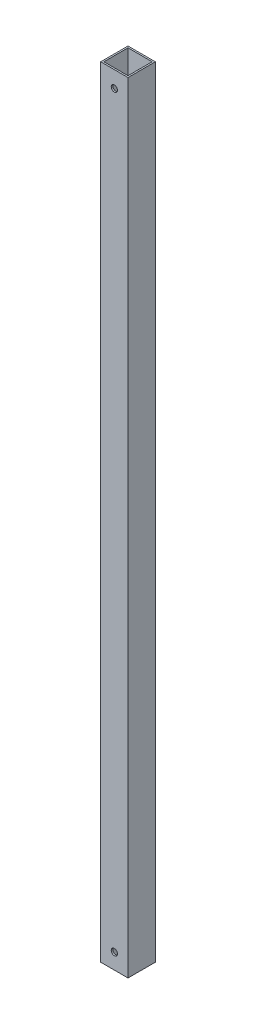
ISO-10303-21;
HEADER;
FILE_DESCRIPTION(('STEP AP214'),'2;1');
FILE_NAME('part.step','',(''),(''),'','','');
FILE_SCHEMA(('AUTOMOTIVE_DESIGN { 1 0 10303 214 1 1 1 1 }'));
ENDSEC;
DATA;
#1=APPLICATION_CONTEXT('core data for automotive mechanical design processes');
#2=APPLICATION_PROTOCOL_DEFINITION('international standard','automotive_design',2000,#1);
#3=PRODUCT_CONTEXT('',#1,'mechanical');
#4=PRODUCT('Part','Part','',(#3));
#5=PRODUCT_RELATED_PRODUCT_CATEGORY('part','',(#4));
#6=PRODUCT_DEFINITION_FORMATION('','',#4);
#7=PRODUCT_DEFINITION_CONTEXT('part definition',#1,'design');
#8=PRODUCT_DEFINITION('design','',#6,#7);
#9=PRODUCT_DEFINITION_SHAPE('','',#8);
#10=(LENGTH_UNIT() NAMED_UNIT(*) SI_UNIT(.MILLI.,.METRE.));
#11=(NAMED_UNIT(*) PLANE_ANGLE_UNIT() SI_UNIT($,.RADIAN.));
#12=(NAMED_UNIT(*) SI_UNIT($,.STERADIAN.) SOLID_ANGLE_UNIT());
#13=UNCERTAINTY_MEASURE_WITH_UNIT(LENGTH_MEASURE(1.E-05),#10,'distance_accuracy_value','');
#14=(GEOMETRIC_REPRESENTATION_CONTEXT(3) GLOBAL_UNCERTAINTY_ASSIGNED_CONTEXT((#13)) GLOBAL_UNIT_ASSIGNED_CONTEXT((#10,
#11,#12)) REPRESENTATION_CONTEXT('',''));
#15=CARTESIAN_POINT('',(0.,0.,0.));
#16=DIRECTION('',(0.,0.,1.));
#17=DIRECTION('',(1.,0.,0.));
#18=AXIS2_PLACEMENT_3D('',#15,#16,#17);
#19=CARTESIAN_POINT('',(0.,1000.,0.));
#20=DIRECTION('',(0.,-1.,0.));
#21=DIRECTION('',(0.,0.,-1.));
#22=AXIS2_PLACEMENT_3D('',#19,#20,#21);
#23=PLANE('',#22);
#24=DIRECTION('',(0.,0.,1.));
#25=VECTOR('',#24,1.);
#26=CARTESIAN_POINT('',(0.,1000.,0.));
#27=LINE('',#26,#25);
#28=CARTESIAN_POINT('',(0.,1000.,-35.));
#29=VERTEX_POINT('',#28);
#30=CARTESIAN_POINT('',(0.,1000.,0.));
#31=VERTEX_POINT('',#30);
#32=EDGE_CURVE('E145',#29,#31,#27,.T.);
#33=ORIENTED_EDGE('',*,*,#32,.T.);
#34=DIRECTION('',(1.,0.,0.));
#35=VECTOR('',#34,1.);
#36=CARTESIAN_POINT('',(0.,1000.,0.));
#37=LINE('',#36,#35);
#38=CARTESIAN_POINT('',(35.,1000.,0.));
#39=VERTEX_POINT('',#38);
#40=EDGE_CURVE('E148',#31,#39,#37,.T.);
#41=ORIENTED_EDGE('',*,*,#40,.T.);
#42=DIRECTION('',(0.,0.,-1.));
#43=VECTOR('',#42,1.);
#44=CARTESIAN_POINT('',(35.,1000.,0.));
#45=LINE('',#44,#43);
#46=CARTESIAN_POINT('',(35.,1000.,-35.));
#47=VERTEX_POINT('',#46);
#48=EDGE_CURVE('E151',#39,#47,#45,.T.);
#49=ORIENTED_EDGE('',*,*,#48,.T.);
#50=DIRECTION('',(-1.,0.,0.));
#51=VECTOR('',#50,1.);
#52=CARTESIAN_POINT('',(0.,1000.,-35.));
#53=LINE('',#52,#51);
#54=EDGE_CURVE('E153',#47,#29,#53,.T.);
#55=ORIENTED_EDGE('',*,*,#54,.T.);
#56=EDGE_LOOP('',(#33,#41,#49,#55));
#57=FACE_BOUND('',#56,.T.);
#58=DIRECTION('',(1.,0.,0.));
#59=VECTOR('',#58,1.);
#60=CARTESIAN_POINT('',(2.,1000.,-2.));
#61=LINE('',#60,#59);
#62=CARTESIAN_POINT('',(2.,1000.,-2.));
#63=VERTEX_POINT('',#62);
#64=CARTESIAN_POINT('',(33.,1000.,-2.));
#65=VERTEX_POINT('',#64);
#66=EDGE_CURVE('E107',#63,#65,#61,.T.);
#67=ORIENTED_EDGE('',*,*,#66,.F.);
#68=DIRECTION('',(0.,0.,1.));
#69=VECTOR('',#68,1.);
#70=CARTESIAN_POINT('',(2.,1000.,-2.));
#71=LINE('',#70,#69);
#72=CARTESIAN_POINT('',(2.,1000.,-33.));
#73=VERTEX_POINT('',#72);
#74=EDGE_CURVE('E129',#73,#63,#71,.T.);
#75=ORIENTED_EDGE('',*,*,#74,.F.);
#76=DIRECTION('',(-1.,0.,0.));
#77=VECTOR('',#76,1.);
#78=CARTESIAN_POINT('',(2.,1000.,-33.));
#79=LINE('',#78,#77);
#80=CARTESIAN_POINT('',(33.,1000.,-33.));
#81=VERTEX_POINT('',#80);
#82=EDGE_CURVE('E127',#81,#73,#79,.T.);
#83=ORIENTED_EDGE('',*,*,#82,.F.);
#84=DIRECTION('',(0.,0.,-1.));
#85=VECTOR('',#84,1.);
#86=CARTESIAN_POINT('',(33.,1000.,-2.));
#87=LINE('',#86,#85);
#88=EDGE_CURVE('E115',#65,#81,#87,.T.);
#89=ORIENTED_EDGE('',*,*,#88,.F.);
#90=EDGE_LOOP('',(#67,#75,#83,#89));
#91=FACE_BOUND('',#90,.T.);
#92=ADVANCED_FACE('F40',(#57,#91),#23,.F.);
#93=CARTESIAN_POINT('',(0.,0.,0.));
#94=DIRECTION('',(0.,-1.,0.));
#95=DIRECTION('',(0.,0.,-1.));
#96=AXIS2_PLACEMENT_3D('',#93,#94,#95);
#97=PLANE('',#96);
#98=DIRECTION('',(0.,0.,1.));
#99=VECTOR('',#98,1.);
#100=CARTESIAN_POINT('',(0.,0.,0.));
#101=LINE('',#100,#99);
#102=CARTESIAN_POINT('',(0.,0.,-35.));
#103=VERTEX_POINT('',#102);
#104=CARTESIAN_POINT('',(0.,0.,0.));
#105=VERTEX_POINT('',#104);
#106=EDGE_CURVE('E123',#103,#105,#101,.T.);
#107=ORIENTED_EDGE('',*,*,#106,.F.);
#108=DIRECTION('',(-1.,0.,0.));
#109=VECTOR('',#108,1.);
#110=CARTESIAN_POINT('',(0.,0.,-35.));
#111=LINE('',#110,#109);
#112=CARTESIAN_POINT('',(35.,0.,-35.));
#113=VERTEX_POINT('',#112);
#114=EDGE_CURVE('E149',#113,#103,#111,.T.);
#115=ORIENTED_EDGE('',*,*,#114,.F.);
#116=DIRECTION('',(0.,0.,-1.));
#117=VECTOR('',#116,1.);
#118=CARTESIAN_POINT('',(35.,0.,0.));
#119=LINE('',#118,#117);
#120=CARTESIAN_POINT('',(35.,0.,0.));
#121=VERTEX_POINT('',#120);
#122=EDGE_CURVE('E160',#121,#113,#119,.T.);
#123=ORIENTED_EDGE('',*,*,#122,.F.);
#124=DIRECTION('',(1.,0.,0.));
#125=VECTOR('',#124,1.);
#126=CARTESIAN_POINT('',(0.,0.,0.));
#127=LINE('',#126,#125);
#128=EDGE_CURVE('E158',#105,#121,#127,.T.);
#129=ORIENTED_EDGE('',*,*,#128,.F.);
#130=EDGE_LOOP('',(#107,#115,#123,#129));
#131=FACE_BOUND('',#130,.T.);
#132=DIRECTION('',(0.,0.,1.));
#133=VECTOR('',#132,1.);
#134=CARTESIAN_POINT('',(2.,0.,-2.));
#135=LINE('',#134,#133);
#136=CARTESIAN_POINT('',(2.,0.,-33.));
#137=VERTEX_POINT('',#136);
#138=CARTESIAN_POINT('',(2.,0.,-2.));
#139=VERTEX_POINT('',#138);
#140=EDGE_CURVE('E116',#137,#139,#135,.T.);
#141=ORIENTED_EDGE('',*,*,#140,.T.);
#142=DIRECTION('',(1.,0.,0.));
#143=VECTOR('',#142,1.);
#144=CARTESIAN_POINT('',(2.,0.,-2.));
#145=LINE('',#144,#143);
#146=CARTESIAN_POINT('',(33.,0.,-2.));
#147=VERTEX_POINT('',#146);
#148=EDGE_CURVE('E65',#139,#147,#145,.T.);
#149=ORIENTED_EDGE('',*,*,#148,.T.);
#150=DIRECTION('',(0.,0.,-1.));
#151=VECTOR('',#150,1.);
#152=CARTESIAN_POINT('',(33.,0.,-2.));
#153=LINE('',#152,#151);
#154=CARTESIAN_POINT('',(33.,0.,-33.));
#155=VERTEX_POINT('',#154);
#156=EDGE_CURVE('E122',#147,#155,#153,.T.);
#157=ORIENTED_EDGE('',*,*,#156,.T.);
#158=DIRECTION('',(-1.,0.,0.));
#159=VECTOR('',#158,1.);
#160=CARTESIAN_POINT('',(2.,0.,-33.));
#161=LINE('',#160,#159);
#162=EDGE_CURVE('E137',#155,#137,#161,.T.);
#163=ORIENTED_EDGE('',*,*,#162,.T.);
#164=EDGE_LOOP('',(#141,#149,#157,#163));
#165=FACE_BOUND('',#164,.T.);
#166=ADVANCED_FACE('F207',(#131,#165),#97,.T.);
#167=CARTESIAN_POINT('',(0.,1000.,0.));
#168=DIRECTION('',(1.,0.,0.));
#169=DIRECTION('',(0.,0.,-1.));
#170=AXIS2_PLACEMENT_3D('',#167,#168,#169);
#171=PLANE('',#170);
#172=ORIENTED_EDGE('',*,*,#106,.T.);
#173=DIRECTION('',(0.,-1.,0.));
#174=VECTOR('',#173,1.);
#175=CARTESIAN_POINT('',(0.,1000.,0.));
#176=LINE('',#175,#174);
#177=EDGE_CURVE('E11',#31,#105,#176,.T.);
#178=ORIENTED_EDGE('',*,*,#177,.F.);
#179=ORIENTED_EDGE('',*,*,#32,.F.);
#180=DIRECTION('',(0.,-1.,0.));
#181=VECTOR('',#180,1.);
#182=CARTESIAN_POINT('',(0.,1000.,-35.));
#183=LINE('',#182,#181);
#184=EDGE_CURVE('E155',#29,#103,#183,.T.);
#185=ORIENTED_EDGE('',*,*,#184,.T.);
#186=EDGE_LOOP('',(#172,#178,#179,#185));
#187=FACE_BOUND('',#186,.T.);
#188=ADVANCED_FACE('F42',(#187),#171,.F.);
#189=CARTESIAN_POINT('',(0.,1000.,0.));
#190=DIRECTION('',(0.,0.,-1.));
#191=DIRECTION('',(-1.,0.,0.));
#192=AXIS2_PLACEMENT_3D('',#189,#190,#191);
#193=PLANE('',#192);
#194=CARTESIAN_POINT('',(17.5,979.,0.));
#195=DIRECTION('',(0.,0.,-1.));
#196=DIRECTION('',(-1.,0.,0.));
#197=AXIS2_PLACEMENT_3D('',#194,#195,#196);
#198=CIRCLE('',#197,4.00000000000002);
#199=CARTESIAN_POINT('',(13.5,979.,0.));
#200=VERTEX_POINT('',#199);
#201=EDGE_CURVE('E189',#200,#200,#198,.T.);
#202=ORIENTED_EDGE('',*,*,#201,.T.);
#203=EDGE_LOOP('',(#202));
#204=FACE_BOUND('',#203,.T.);
#205=CARTESIAN_POINT('',(17.5,20.,0.));
#206=DIRECTION('',(0.,0.,1.));
#207=DIRECTION('',(1.,0.,0.));
#208=AXIS2_PLACEMENT_3D('',#205,#206,#207);
#209=CIRCLE('',#208,4.);
#210=CARTESIAN_POINT('',(21.5,20.,0.));
#211=VERTEX_POINT('',#210);
#212=EDGE_CURVE('E176',#211,#211,#209,.T.);
#213=ORIENTED_EDGE('',*,*,#212,.F.);
#214=EDGE_LOOP('',(#213));
#215=FACE_BOUND('',#214,.T.);
#216=ORIENTED_EDGE('',*,*,#128,.T.);
#217=DIRECTION('',(0.,-1.,0.));
#218=VECTOR('',#217,1.);
#219=CARTESIAN_POINT('',(35.,1000.,0.));
#220=LINE('',#219,#218);
#221=EDGE_CURVE('E49',#39,#121,#220,.T.);
#222=ORIENTED_EDGE('',*,*,#221,.F.);
#223=ORIENTED_EDGE('',*,*,#40,.F.);
#224=ORIENTED_EDGE('',*,*,#177,.T.);
#225=EDGE_LOOP('',(#216,#222,#223,#224));
#226=FACE_BOUND('',#225,.T.);
#227=ADVANCED_FACE('F234',(#204,#215,#226),#193,.F.);
#228=CARTESIAN_POINT('',(35.,1000.,0.));
#229=DIRECTION('',(-1.,0.,0.));
#230=DIRECTION('',(0.,0.,1.));
#231=AXIS2_PLACEMENT_3D('',#228,#229,#230);
#232=PLANE('',#231);
#233=ORIENTED_EDGE('',*,*,#122,.T.);
#234=DIRECTION('',(0.,-1.,0.));
#235=VECTOR('',#234,1.);
#236=CARTESIAN_POINT('',(35.,1000.,-35.));
#237=LINE('',#236,#235);
#238=EDGE_CURVE('E165',#47,#113,#237,.T.);
#239=ORIENTED_EDGE('',*,*,#238,.F.);
#240=ORIENTED_EDGE('',*,*,#48,.F.);
#241=ORIENTED_EDGE('',*,*,#221,.T.);
#242=EDGE_LOOP('',(#233,#239,#240,#241));
#243=FACE_BOUND('',#242,.T.);
#244=ADVANCED_FACE('F231',(#243),#232,.F.);
#245=CARTESIAN_POINT('',(0.,1000.,-35.));
#246=DIRECTION('',(0.,0.,1.));
#247=DIRECTION('',(1.,0.,0.));
#248=AXIS2_PLACEMENT_3D('',#245,#246,#247);
#249=PLANE('',#248);
#250=CARTESIAN_POINT('',(17.5,979.,-35.));
#251=DIRECTION('',(0.,0.,-1.));
#252=DIRECTION('',(-1.,0.,0.));
#253=AXIS2_PLACEMENT_3D('',#250,#251,#252);
#254=CIRCLE('',#253,4.00000000000002);
#255=CARTESIAN_POINT('',(13.5,979.,-35.));
#256=VERTEX_POINT('',#255);
#257=EDGE_CURVE('E186',#256,#256,#254,.T.);
#258=ORIENTED_EDGE('',*,*,#257,.F.);
#259=EDGE_LOOP('',(#258));
#260=FACE_BOUND('',#259,.T.);
#261=CARTESIAN_POINT('',(17.5,20.,-35.));
#262=DIRECTION('',(0.,0.,1.));
#263=DIRECTION('',(1.,0.,0.));
#264=AXIS2_PLACEMENT_3D('',#261,#262,#263);
#265=CIRCLE('',#264,4.);
#266=CARTESIAN_POINT('',(21.5,20.,-35.));
#267=VERTEX_POINT('',#266);
#268=EDGE_CURVE('E171',#267,#267,#265,.T.);
#269=ORIENTED_EDGE('',*,*,#268,.T.);
#270=EDGE_LOOP('',(#269));
#271=FACE_BOUND('',#270,.T.);
#272=ORIENTED_EDGE('',*,*,#114,.T.);
#273=ORIENTED_EDGE('',*,*,#184,.F.);
#274=ORIENTED_EDGE('',*,*,#54,.F.);
#275=ORIENTED_EDGE('',*,*,#238,.T.);
#276=EDGE_LOOP('',(#272,#273,#274,#275));
#277=FACE_BOUND('',#276,.T.);
#278=ADVANCED_FACE('F228',(#260,#271,#277),#249,.F.);
#279=CARTESIAN_POINT('',(2.,1000.,-2.));
#280=DIRECTION('',(0.,0.,-1.));
#281=DIRECTION('',(-1.,0.,0.));
#282=AXIS2_PLACEMENT_3D('',#279,#280,#281);
#283=PLANE('',#282);
#284=CARTESIAN_POINT('',(17.5,979.,-2.));
#285=DIRECTION('',(0.,0.,-1.));
#286=DIRECTION('',(-1.,0.,0.));
#287=AXIS2_PLACEMENT_3D('',#284,#285,#286);
#288=CIRCLE('',#287,4.00000000000002);
#289=CARTESIAN_POINT('',(13.5,979.,-2.));
#290=VERTEX_POINT('',#289);
#291=EDGE_CURVE('E181',#290,#290,#288,.T.);
#292=ORIENTED_EDGE('',*,*,#291,.F.);
#293=EDGE_LOOP('',(#292));
#294=FACE_BOUND('',#293,.T.);
#295=CARTESIAN_POINT('',(17.5,20.,-2.));
#296=DIRECTION('',(0.,0.,-1.));
#297=DIRECTION('',(-1.,0.,0.));
#298=AXIS2_PLACEMENT_3D('',#295,#296,#297);
#299=CIRCLE('',#298,4.);
#300=CARTESIAN_POINT('',(13.5,20.,-2.));
#301=VERTEX_POINT('',#300);
#302=EDGE_CURVE('E135',#301,#301,#299,.T.);
#303=ORIENTED_EDGE('',*,*,#302,.F.);
#304=EDGE_LOOP('',(#303));
#305=FACE_BOUND('',#304,.T.);
#306=ORIENTED_EDGE('',*,*,#148,.F.);
#307=DIRECTION('',(0.,-1.,0.));
#308=VECTOR('',#307,1.);
#309=CARTESIAN_POINT('',(2.,1000.,-2.));
#310=LINE('',#309,#308);
#311=EDGE_CURVE('E111',#63,#139,#310,.T.);
#312=ORIENTED_EDGE('',*,*,#311,.F.);
#313=ORIENTED_EDGE('',*,*,#66,.T.);
#314=DIRECTION('',(0.,-1.,0.));
#315=VECTOR('',#314,1.);
#316=CARTESIAN_POINT('',(33.,1000.,-2.));
#317=LINE('',#316,#315);
#318=EDGE_CURVE('E110',#65,#147,#317,.T.);
#319=ORIENTED_EDGE('',*,*,#318,.T.);
#320=EDGE_LOOP('',(#306,#312,#313,#319));
#321=FACE_BOUND('',#320,.T.);
#322=ADVANCED_FACE('F109',(#294,#305,#321),#283,.T.);
#323=CARTESIAN_POINT('',(33.,1000.,-2.));
#324=DIRECTION('',(-1.,0.,0.));
#325=DIRECTION('',(0.,0.,1.));
#326=AXIS2_PLACEMENT_3D('',#323,#324,#325);
#327=PLANE('',#326);
#328=ORIENTED_EDGE('',*,*,#156,.F.);
#329=ORIENTED_EDGE('',*,*,#318,.F.);
#330=ORIENTED_EDGE('',*,*,#88,.T.);
#331=DIRECTION('',(0.,-1.,0.));
#332=VECTOR('',#331,1.);
#333=CARTESIAN_POINT('',(33.,1000.,-33.));
#334=LINE('',#333,#332);
#335=EDGE_CURVE('E124',#81,#155,#334,.T.);
#336=ORIENTED_EDGE('',*,*,#335,.T.);
#337=EDGE_LOOP('',(#328,#329,#330,#336));
#338=FACE_BOUND('',#337,.T.);
#339=ADVANCED_FACE('F119',(#338),#327,.T.);
#340=CARTESIAN_POINT('',(2.,1000.,-33.));
#341=DIRECTION('',(0.,0.,1.));
#342=DIRECTION('',(1.,0.,0.));
#343=AXIS2_PLACEMENT_3D('',#340,#341,#342);
#344=PLANE('',#343);
#345=CARTESIAN_POINT('',(17.5,979.,-33.));
#346=DIRECTION('',(0.,0.,1.));
#347=DIRECTION('',(1.,0.,0.));
#348=AXIS2_PLACEMENT_3D('',#345,#346,#347);
#349=CIRCLE('',#348,4.00000000000002);
#350=CARTESIAN_POINT('',(21.5,979.,-33.));
#351=VERTEX_POINT('',#350);
#352=EDGE_CURVE('E44',#351,#351,#349,.T.);
#353=ORIENTED_EDGE('',*,*,#352,.F.);
#354=EDGE_LOOP('',(#353));
#355=FACE_BOUND('',#354,.T.);
#356=CARTESIAN_POINT('',(17.5,20.,-33.));
#357=DIRECTION('',(0.,0.,1.));
#358=DIRECTION('',(1.,0.,0.));
#359=AXIS2_PLACEMENT_3D('',#356,#357,#358);
#360=CIRCLE('',#359,4.);
#361=CARTESIAN_POINT('',(21.5,20.,-33.));
#362=VERTEX_POINT('',#361);
#363=EDGE_CURVE('E169',#362,#362,#360,.T.);
#364=ORIENTED_EDGE('',*,*,#363,.F.);
#365=EDGE_LOOP('',(#364));
#366=FACE_BOUND('',#365,.T.);
#367=ORIENTED_EDGE('',*,*,#162,.F.);
#368=ORIENTED_EDGE('',*,*,#335,.F.);
#369=ORIENTED_EDGE('',*,*,#82,.T.);
#370=DIRECTION('',(0.,-1.,0.));
#371=VECTOR('',#370,1.);
#372=CARTESIAN_POINT('',(2.,1000.,-33.));
#373=LINE('',#372,#371);
#374=EDGE_CURVE('E57',#73,#137,#373,.T.);
#375=ORIENTED_EDGE('',*,*,#374,.T.);
#376=EDGE_LOOP('',(#367,#368,#369,#375));
#377=FACE_BOUND('',#376,.T.);
#378=ADVANCED_FACE('F199',(#355,#366,#377),#344,.T.);
#379=CARTESIAN_POINT('',(2.,1000.,-2.));
#380=DIRECTION('',(1.,0.,0.));
#381=DIRECTION('',(0.,0.,-1.));
#382=AXIS2_PLACEMENT_3D('',#379,#380,#381);
#383=PLANE('',#382);
#384=ORIENTED_EDGE('',*,*,#140,.F.);
#385=ORIENTED_EDGE('',*,*,#374,.F.);
#386=ORIENTED_EDGE('',*,*,#74,.T.);
#387=ORIENTED_EDGE('',*,*,#311,.T.);
#388=EDGE_LOOP('',(#384,#385,#386,#387));
#389=FACE_BOUND('',#388,.T.);
#390=ADVANCED_FACE('F202',(#389),#383,.T.);
#391=CARTESIAN_POINT('',(17.5,20.,-35.));
#392=DIRECTION('',(0.,0.,1.));
#393=DIRECTION('',(1.,0.,0.));
#394=AXIS2_PLACEMENT_3D('',#391,#392,#393);
#395=CYLINDRICAL_SURFACE('',#394,4.);
#396=ORIENTED_EDGE('',*,*,#363,.T.);
#397=EDGE_LOOP('',(#396));
#398=FACE_BOUND('',#397,.T.);
#399=ORIENTED_EDGE('',*,*,#268,.F.);
#400=EDGE_LOOP('',(#399));
#401=FACE_BOUND('',#400,.T.);
#402=ADVANCED_FACE('F209',(#398,#401),#395,.F.);
#403=ORIENTED_EDGE('',*,*,#302,.T.);
#404=EDGE_LOOP('',(#403));
#405=FACE_BOUND('',#404,.T.);
#406=ORIENTED_EDGE('',*,*,#212,.T.);
#407=EDGE_LOOP('',(#406));
#408=FACE_BOUND('',#407,.T.);
#409=ADVANCED_FACE('F215',(#405,#408),#395,.F.);
#410=CARTESIAN_POINT('',(17.5,979.,0.));
#411=DIRECTION('',(0.,0.,-1.));
#412=DIRECTION('',(-1.,0.,0.));
#413=AXIS2_PLACEMENT_3D('',#410,#411,#412);
#414=CYLINDRICAL_SURFACE('',#413,4.00000000000002);
#415=ORIENTED_EDGE('',*,*,#352,.T.);
#416=EDGE_LOOP('',(#415));
#417=FACE_BOUND('',#416,.T.);
#418=ORIENTED_EDGE('',*,*,#257,.T.);
#419=EDGE_LOOP('',(#418));
#420=FACE_BOUND('',#419,.T.);
#421=ADVANCED_FACE('F196',(#417,#420),#414,.F.);
#422=ORIENTED_EDGE('',*,*,#291,.T.);
#423=EDGE_LOOP('',(#422));
#424=FACE_BOUND('',#423,.T.);
#425=ORIENTED_EDGE('',*,*,#201,.F.);
#426=EDGE_LOOP('',(#425));
#427=FACE_BOUND('',#426,.T.);
#428=ADVANCED_FACE('F261',(#424,#427),#414,.F.);
#429=CLOSED_SHELL('',(#92,#166,#188,#227,#244,#278,#322,#339,#378,#390,#402,#409,#421,#428));
#430=MANIFOLD_SOLID_BREP('B2',#429);
#431=ADVANCED_BREP_SHAPE_REPRESENTATION('',(#18,#430),#14);
#432=SHAPE_DEFINITION_REPRESENTATION(#9,#431);
ENDSEC;
END-ISO-10303-21;
